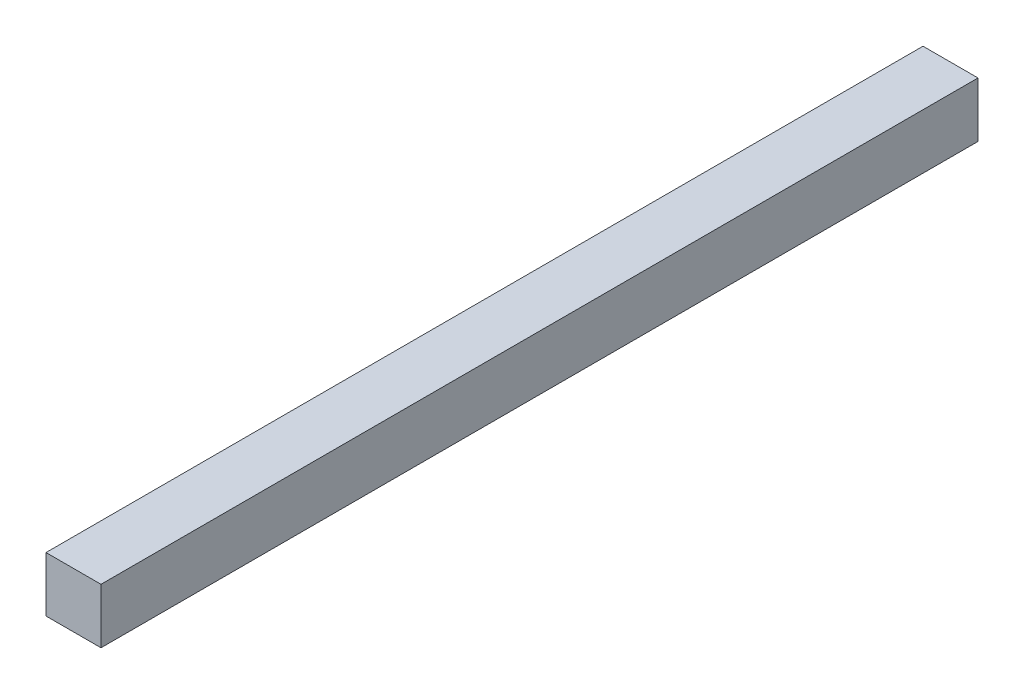
ISO-10303-21;
HEADER;
FILE_DESCRIPTION(('STEP AP214'),'2;1');
FILE_NAME('part.step','',(''),(''),'','','');
FILE_SCHEMA(('AUTOMOTIVE_DESIGN { 1 0 10303 214 1 1 1 1 }'));
ENDSEC;
DATA;
#1=APPLICATION_CONTEXT('core data for automotive mechanical design processes');
#2=APPLICATION_PROTOCOL_DEFINITION('international standard','automotive_design',2000,#1);
#3=PRODUCT_CONTEXT('',#1,'mechanical');
#4=PRODUCT('Part','Part','',(#3));
#5=PRODUCT_RELATED_PRODUCT_CATEGORY('part','',(#4));
#6=PRODUCT_DEFINITION_FORMATION('','',#4);
#7=PRODUCT_DEFINITION_CONTEXT('part definition',#1,'design');
#8=PRODUCT_DEFINITION('design','',#6,#7);
#9=PRODUCT_DEFINITION_SHAPE('','',#8);
#10=(LENGTH_UNIT() NAMED_UNIT(*) SI_UNIT(.MILLI.,.METRE.));
#11=(NAMED_UNIT(*) PLANE_ANGLE_UNIT() SI_UNIT($,.RADIAN.));
#12=(NAMED_UNIT(*) SI_UNIT($,.STERADIAN.) SOLID_ANGLE_UNIT());
#13=UNCERTAINTY_MEASURE_WITH_UNIT(LENGTH_MEASURE(1.E-05),#10,'distance_accuracy_value','');
#14=(GEOMETRIC_REPRESENTATION_CONTEXT(3) GLOBAL_UNCERTAINTY_ASSIGNED_CONTEXT((#13)) GLOBAL_UNIT_ASSIGNED_CONTEXT((#10,
#11,#12)) REPRESENTATION_CONTEXT('',''));
#15=CARTESIAN_POINT('',(0.,0.,0.));
#16=DIRECTION('',(0.,0.,1.));
#17=DIRECTION('',(1.,0.,0.));
#18=AXIS2_PLACEMENT_3D('',#15,#16,#17);
#19=CARTESIAN_POINT('',(0.254,0.254,0.));
#20=DIRECTION('',(0.,-1.,0.));
#21=DIRECTION('',(0.,0.,-1.));
#22=AXIS2_PLACEMENT_3D('',#19,#20,#21);
#23=PLANE('',#22);
#24=DIRECTION('',(0.,0.,-1.));
#25=VECTOR('',#24,1.);
#26=CARTESIAN_POINT('',(-0.254,0.254,0.));
#27=LINE('',#26,#25);
#28=CARTESIAN_POINT('',(-0.254,0.254,0.));
#29=VERTEX_POINT('',#28);
#30=CARTESIAN_POINT('',(-0.254,0.254,8.1));
#31=VERTEX_POINT('',#30);
#32=EDGE_CURVE('E58',#29,#31,#27,.F.);
#33=ORIENTED_EDGE('',*,*,#32,.T.);
#34=DIRECTION('',(-1.,0.,0.));
#35=VECTOR('',#34,1.);
#36=CARTESIAN_POINT('',(-0.254,0.254,8.1));
#37=LINE('',#36,#35);
#38=CARTESIAN_POINT('',(0.254,0.254,8.1));
#39=VERTEX_POINT('',#38);
#40=EDGE_CURVE('E55',#31,#39,#37,.F.);
#41=ORIENTED_EDGE('',*,*,#40,.T.);
#42=DIRECTION('',(0.,0.,1.));
#43=VECTOR('',#42,1.);
#44=CARTESIAN_POINT('',(0.254,0.254,0.));
#45=LINE('',#44,#43);
#46=CARTESIAN_POINT('',(0.254,0.254,0.));
#47=VERTEX_POINT('',#46);
#48=EDGE_CURVE('E77',#39,#47,#45,.F.);
#49=ORIENTED_EDGE('',*,*,#48,.T.);
#50=DIRECTION('',(1.,0.,0.));
#51=VECTOR('',#50,1.);
#52=CARTESIAN_POINT('',(0.254,0.254,0.));
#53=LINE('',#52,#51);
#54=EDGE_CURVE('E20',#29,#47,#53,.T.);
#55=ORIENTED_EDGE('',*,*,#54,.F.);
#56=EDGE_LOOP('',(#33,#41,#49,#55));
#57=FACE_BOUND('',#56,.T.);
#58=ADVANCED_FACE('F17',(#57),#23,.F.);
#59=CARTESIAN_POINT('',(-0.254,0.254,0.));
#60=DIRECTION('',(1.,0.,0.));
#61=DIRECTION('',(0.,0.,-1.));
#62=AXIS2_PLACEMENT_3D('',#59,#60,#61);
#63=PLANE('',#62);
#64=DIRECTION('',(0.,0.,1.));
#65=VECTOR('',#64,1.);
#66=CARTESIAN_POINT('',(-0.254,-0.254,0.));
#67=LINE('',#66,#65);
#68=CARTESIAN_POINT('',(-0.254,-0.254,0.));
#69=VERTEX_POINT('',#68);
#70=CARTESIAN_POINT('',(-0.254,-0.254,8.1));
#71=VERTEX_POINT('',#70);
#72=EDGE_CURVE('E73',#69,#71,#67,.T.);
#73=ORIENTED_EDGE('',*,*,#72,.T.);
#74=DIRECTION('',(0.,1.,0.));
#75=VECTOR('',#74,1.);
#76=CARTESIAN_POINT('',(-0.254,-0.254,8.1));
#77=LINE('',#76,#75);
#78=EDGE_CURVE('E63',#71,#31,#77,.T.);
#79=ORIENTED_EDGE('',*,*,#78,.T.);
#80=ORIENTED_EDGE('',*,*,#32,.F.);
#81=DIRECTION('',(0.,1.,0.));
#82=VECTOR('',#81,1.);
#83=CARTESIAN_POINT('',(-0.254,-0.254,0.));
#84=LINE('',#83,#82);
#85=EDGE_CURVE('E79',#69,#29,#84,.T.);
#86=ORIENTED_EDGE('',*,*,#85,.F.);
#87=EDGE_LOOP('',(#73,#79,#80,#86));
#88=FACE_BOUND('',#87,.T.);
#89=ADVANCED_FACE('F72',(#88),#63,.F.);
#90=CARTESIAN_POINT('',(-0.254,-0.254,8.1));
#91=DIRECTION('',(0.,0.,-1.));
#92=DIRECTION('',(-1.,0.,0.));
#93=AXIS2_PLACEMENT_3D('',#90,#91,#92);
#94=PLANE('',#93);
#95=DIRECTION('',(0.,1.,0.));
#96=VECTOR('',#95,1.);
#97=CARTESIAN_POINT('',(0.254,-0.254,8.1));
#98=LINE('',#97,#96);
#99=CARTESIAN_POINT('',(0.254,-0.254,8.1));
#100=VERTEX_POINT('',#99);
#101=EDGE_CURVE('E69',#100,#39,#98,.T.);
#102=ORIENTED_EDGE('',*,*,#101,.T.);
#103=ORIENTED_EDGE('',*,*,#40,.F.);
#104=ORIENTED_EDGE('',*,*,#78,.F.);
#105=DIRECTION('',(1.,0.,0.));
#106=VECTOR('',#105,1.);
#107=CARTESIAN_POINT('',(-0.254,-0.254,8.1));
#108=LINE('',#107,#106);
#109=EDGE_CURVE('E83',#71,#100,#108,.T.);
#110=ORIENTED_EDGE('',*,*,#109,.T.);
#111=EDGE_LOOP('',(#102,#103,#104,#110));
#112=FACE_BOUND('',#111,.T.);
#113=ADVANCED_FACE('F66',(#112),#94,.F.);
#114=CARTESIAN_POINT('',(0.254,-0.254,0.));
#115=DIRECTION('',(-1.,0.,0.));
#116=DIRECTION('',(0.,0.,1.));
#117=AXIS2_PLACEMENT_3D('',#114,#115,#116);
#118=PLANE('',#117);
#119=ORIENTED_EDGE('',*,*,#48,.F.);
#120=ORIENTED_EDGE('',*,*,#101,.F.);
#121=DIRECTION('',(0.,0.,1.));
#122=VECTOR('',#121,1.);
#123=CARTESIAN_POINT('',(0.254,-0.254,0.));
#124=LINE('',#123,#122);
#125=CARTESIAN_POINT('',(0.254,-0.254,0.));
#126=VERTEX_POINT('',#125);
#127=EDGE_CURVE('E26',#100,#126,#124,.F.);
#128=ORIENTED_EDGE('',*,*,#127,.T.);
#129=DIRECTION('',(0.,1.,0.));
#130=VECTOR('',#129,1.);
#131=CARTESIAN_POINT('',(0.254,-0.254,0.));
#132=LINE('',#131,#130);
#133=EDGE_CURVE('E34',#47,#126,#132,.F.);
#134=ORIENTED_EDGE('',*,*,#133,.F.);
#135=EDGE_LOOP('',(#119,#120,#128,#134));
#136=FACE_BOUND('',#135,.T.);
#137=ADVANCED_FACE('F88',(#136),#118,.F.);
#138=CARTESIAN_POINT('',(-0.254,-0.254,0.));
#139=DIRECTION('',(0.,0.,-1.));
#140=DIRECTION('',(-1.,0.,0.));
#141=AXIS2_PLACEMENT_3D('',#138,#139,#140);
#142=PLANE('',#141);
#143=ORIENTED_EDGE('',*,*,#133,.T.);
#144=DIRECTION('',(1.,0.,0.));
#145=VECTOR('',#144,1.);
#146=CARTESIAN_POINT('',(-0.254,-0.254,0.));
#147=LINE('',#146,#145);
#148=EDGE_CURVE('E11',#126,#69,#147,.F.);
#149=ORIENTED_EDGE('',*,*,#148,.T.);
#150=ORIENTED_EDGE('',*,*,#85,.T.);
#151=ORIENTED_EDGE('',*,*,#54,.T.);
#152=EDGE_LOOP('',(#143,#149,#150,#151));
#153=FACE_BOUND('',#152,.T.);
#154=ADVANCED_FACE('F91',(#153),#142,.T.);
#155=CARTESIAN_POINT('',(-0.254,-0.254,0.));
#156=DIRECTION('',(0.,1.,0.));
#157=DIRECTION('',(0.,0.,1.));
#158=AXIS2_PLACEMENT_3D('',#155,#156,#157);
#159=PLANE('',#158);
#160=ORIENTED_EDGE('',*,*,#127,.F.);
#161=ORIENTED_EDGE('',*,*,#109,.F.);
#162=ORIENTED_EDGE('',*,*,#72,.F.);
#163=ORIENTED_EDGE('',*,*,#148,.F.);
#164=EDGE_LOOP('',(#160,#161,#162,#163));
#165=FACE_BOUND('',#164,.T.);
#166=ADVANCED_FACE('F90',(#165),#159,.F.);
#167=CLOSED_SHELL('',(#58,#89,#113,#137,#154,#166));
#168=MANIFOLD_SOLID_BREP('B1',#167);
#169=ADVANCED_BREP_SHAPE_REPRESENTATION('',(#18,#168),#14);
#170=SHAPE_DEFINITION_REPRESENTATION(#9,#169);
ENDSEC;
END-ISO-10303-21;
